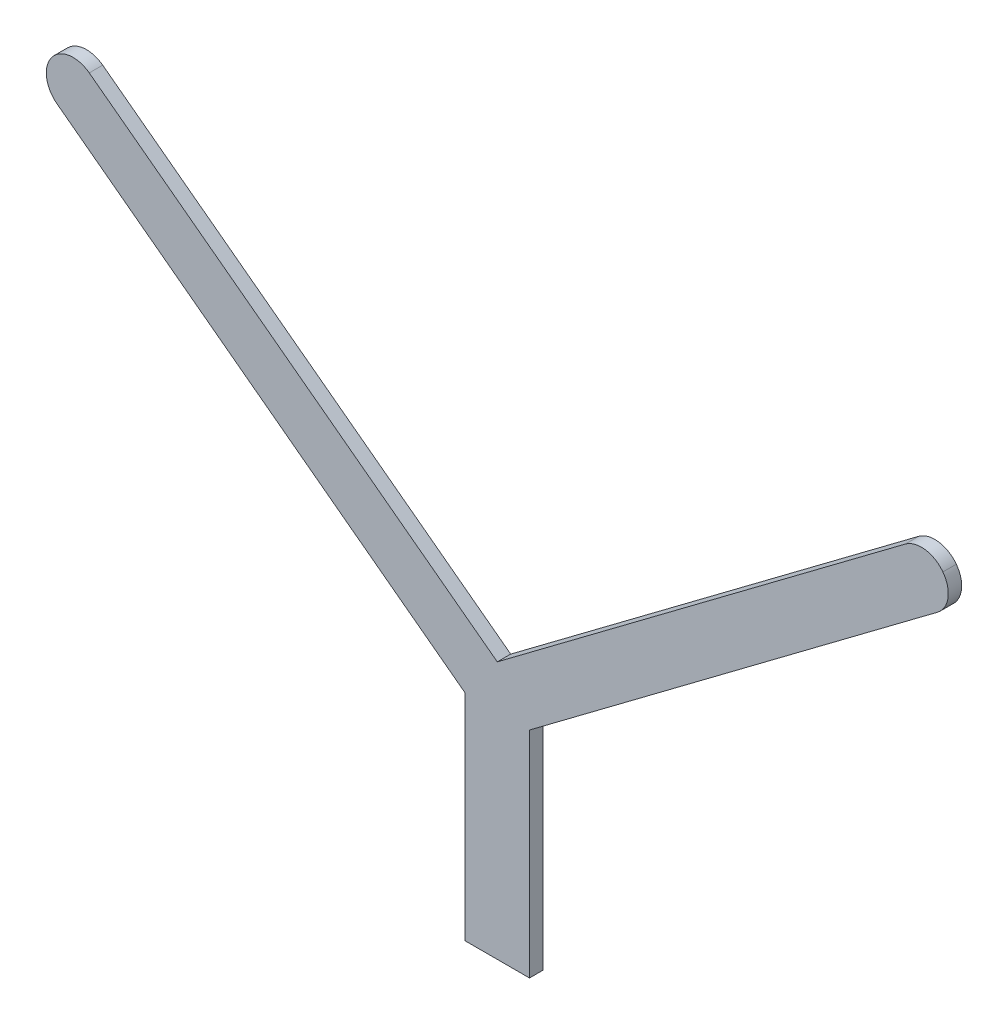
ISO-10303-21;
HEADER;
FILE_DESCRIPTION(('STEP AP214'),'2;1');
FILE_NAME('part.step','',(''),(''),'','','');
FILE_SCHEMA(('AUTOMOTIVE_DESIGN { 1 0 10303 214 1 1 1 1 }'));
ENDSEC;
DATA;
#1=APPLICATION_CONTEXT('core data for automotive mechanical design processes');
#2=APPLICATION_PROTOCOL_DEFINITION('international standard','automotive_design',2000,#1);
#3=PRODUCT_CONTEXT('',#1,'mechanical');
#4=PRODUCT('Part','Part','',(#3));
#5=PRODUCT_RELATED_PRODUCT_CATEGORY('part','',(#4));
#6=PRODUCT_DEFINITION_FORMATION('','',#4);
#7=PRODUCT_DEFINITION_CONTEXT('part definition',#1,'design');
#8=PRODUCT_DEFINITION('design','',#6,#7);
#9=PRODUCT_DEFINITION_SHAPE('','',#8);
#10=(LENGTH_UNIT() NAMED_UNIT(*) SI_UNIT(.MILLI.,.METRE.));
#11=(NAMED_UNIT(*) PLANE_ANGLE_UNIT() SI_UNIT($,.RADIAN.));
#12=(NAMED_UNIT(*) SI_UNIT($,.STERADIAN.) SOLID_ANGLE_UNIT());
#13=UNCERTAINTY_MEASURE_WITH_UNIT(LENGTH_MEASURE(1.E-05),#10,'distance_accuracy_value','');
#14=(GEOMETRIC_REPRESENTATION_CONTEXT(3) GLOBAL_UNCERTAINTY_ASSIGNED_CONTEXT((#13)) GLOBAL_UNIT_ASSIGNED_CONTEXT((#10,
#11,#12)) REPRESENTATION_CONTEXT('',''));
#15=CARTESIAN_POINT('',(0.,0.,0.));
#16=DIRECTION('',(0.,0.,1.));
#17=DIRECTION('',(1.,0.,0.));
#18=AXIS2_PLACEMENT_3D('',#15,#16,#17);
#19=CARTESIAN_POINT('',(0.,-507.797500764235,6.35));
#20=DIRECTION('',(-0.600003418919726,0.79999743579879,0.));
#21=DIRECTION('',(-0.79999743579879,-0.600003418919726,0.));
#22=AXIS2_PLACEMENT_3D('',#19,#20,#21);
#23=PLANE('',#22);
#24=DIRECTION('',(0.79999743579879,0.600003418919726,0.));
#25=VECTOR('',#24,1.);
#26=CARTESIAN_POINT('',(0.,-507.797500764235,6.35));
#27=LINE('',#26,#25);
#28=CARTESIAN_POINT('',(0.,-507.797500764235,6.35));
#29=VERTEX_POINT('',#28);
#30=CARTESIAN_POINT('',(193.040032565359,-363.016187294223,6.35));
#31=VERTEX_POINT('',#30);
#32=EDGE_CURVE('E149',#29,#31,#27,.T.);
#33=ORIENTED_EDGE('',*,*,#32,.T.);
#34=DIRECTION('',(0.,0.,-1.));
#35=VECTOR('',#34,1.);
#36=CARTESIAN_POINT('',(193.040032565359,-363.016187294223,6.35));
#37=LINE('',#36,#35);
#38=CARTESIAN_POINT('',(193.040032565359,-363.016187294223,0.));
#39=VERTEX_POINT('',#38);
#40=EDGE_CURVE('E160',#31,#39,#37,.T.);
#41=ORIENTED_EDGE('',*,*,#40,.T.);
#42=DIRECTION('',(0.79999743579879,0.600003418919726,0.));
#43=VECTOR('',#42,1.);
#44=CARTESIAN_POINT('',(0.,-507.797500764235,0.));
#45=LINE('',#44,#43);
#46=CARTESIAN_POINT('',(0.,-507.797500764235,0.));
#47=VERTEX_POINT('',#46);
#48=EDGE_CURVE('E133',#47,#39,#45,.T.);
#49=ORIENTED_EDGE('',*,*,#48,.F.);
#50=DIRECTION('',(0.,0.,-1.));
#51=VECTOR('',#50,1.);
#52=CARTESIAN_POINT('',(0.,-507.797500764235,6.35));
#53=LINE('',#52,#51);
#54=EDGE_CURVE('E165',#29,#47,#53,.T.);
#55=ORIENTED_EDGE('',*,*,#54,.F.);
#56=EDGE_LOOP('',(#33,#41,#49,#55));
#57=FACE_BOUND('',#56,.T.);
#58=ADVANCED_FACE('F39',(#57),#23,.T.);
#59=CARTESIAN_POINT('',(-203.199999999996,-355.396143873933,6.35));
#60=DIRECTION('',(0.600003418919763,0.799997435798762,0.));
#61=DIRECTION('',(-0.799997435798762,0.600003418919763,0.));
#62=AXIS2_PLACEMENT_3D('',#59,#60,#61);
#63=PLANE('',#62);
#64=DIRECTION('',(0.799997435798762,-0.600003418919763,0.));
#65=VECTOR('',#64,1.);
#66=CARTESIAN_POINT('',(-203.199999999996,-355.396143873933,0.));
#67=LINE('',#66,#65);
#68=CARTESIAN_POINT('',(-193.040032565352,-363.016187294214,0.));
#69=VERTEX_POINT('',#68);
#70=EDGE_CURVE('E240',#69,#47,#67,.T.);
#71=ORIENTED_EDGE('',*,*,#70,.F.);
#72=DIRECTION('',(0.,0.,-1.));
#73=VECTOR('',#72,1.);
#74=CARTESIAN_POINT('',(-193.040032565352,-363.016187294214,6.35));
#75=LINE('',#74,#73);
#76=CARTESIAN_POINT('',(-193.040032565352,-363.016187294214,6.35));
#77=VERTEX_POINT('',#76);
#78=EDGE_CURVE('E190',#69,#77,#75,.F.);
#79=ORIENTED_EDGE('',*,*,#78,.T.);
#80=DIRECTION('',(0.799997435798762,-0.600003418919763,0.));
#81=VECTOR('',#80,1.);
#82=CARTESIAN_POINT('',(-203.199999999996,-355.396143873933,6.35));
#83=LINE('',#82,#81);
#84=EDGE_CURVE('E156',#77,#29,#83,.T.);
#85=ORIENTED_EDGE('',*,*,#84,.T.);
#86=ORIENTED_EDGE('',*,*,#54,.T.);
#87=EDGE_LOOP('',(#71,#79,#85,#86));
#88=FACE_BOUND('',#87,.T.);
#89=ADVANCED_FACE('F269',(#88),#63,.T.);
#90=CARTESIAN_POINT('',(-218.440086840558,-375.716078743222,6.35));
#91=DIRECTION('',(0.600003418919763,0.799997435798762,0.));
#92=DIRECTION('',(-0.799997435798762,0.600003418919763,0.));
#93=AXIS2_PLACEMENT_3D('',#90,#91,#92);
#94=PLANE('',#93);
#95=DIRECTION('',(0.799997435798763,-0.600003418919763,0.));
#96=VECTOR('',#95,1.);
#97=CARTESIAN_POINT('',(-218.440086840558,-375.716078743222,6.35));
#98=LINE('',#97,#96);
#99=CARTESIAN_POINT('',(-208.280119405914,-383.336122163503,6.35));
#100=VERTEX_POINT('',#99);
#101=CARTESIAN_POINT('',(-15.2400868405617,-528.117435633524,6.35));
#102=VERTEX_POINT('',#101);
#103=EDGE_CURVE('E215',#100,#102,#98,.T.);
#104=ORIENTED_EDGE('',*,*,#103,.F.);
#105=DIRECTION('',(0.,0.,-1.));
#106=VECTOR('',#105,1.);
#107=CARTESIAN_POINT('',(-208.280119405914,-383.336122163503,6.35));
#108=LINE('',#107,#106);
#109=CARTESIAN_POINT('',(-208.280119405914,-383.336122163503,0.));
#110=VERTEX_POINT('',#109);
#111=EDGE_CURVE('E196',#100,#110,#108,.T.);
#112=ORIENTED_EDGE('',*,*,#111,.T.);
#113=DIRECTION('',(0.799997435798763,-0.600003418919763,0.));
#114=VECTOR('',#113,1.);
#115=CARTESIAN_POINT('',(-218.440086840558,-375.716078743222,0.));
#116=LINE('',#115,#114);
#117=CARTESIAN_POINT('',(-15.2400868405617,-528.117435633524,0.));
#118=VERTEX_POINT('',#117);
#119=EDGE_CURVE('E205',#110,#118,#116,.T.);
#120=ORIENTED_EDGE('',*,*,#119,.T.);
#121=DIRECTION('',(0.,0.,-1.));
#122=VECTOR('',#121,1.);
#123=CARTESIAN_POINT('',(-15.2400868405617,-528.117435633524,6.35));
#124=LINE('',#123,#122);
#125=EDGE_CURVE('E216',#102,#118,#124,.T.);
#126=ORIENTED_EDGE('',*,*,#125,.F.);
#127=EDGE_LOOP('',(#104,#112,#120,#126));
#128=FACE_BOUND('',#127,.T.);
#129=ADVANCED_FACE('F212',(#128),#94,.F.);
#130=CARTESIAN_POINT('',(-15.2400868405617,-528.117435633524,6.35));
#131=DIRECTION('',(1.,0.,0.));
#132=DIRECTION('',(0.,1.,0.));
#133=AXIS2_PLACEMENT_3D('',#130,#131,#132);
#134=PLANE('',#133);
#135=DIRECTION('',(0.,-1.,0.));
#136=VECTOR('',#135,1.);
#137=CARTESIAN_POINT('',(-15.2400868405617,-528.117435633524,0.));
#138=LINE('',#137,#136);
#139=CARTESIAN_POINT('',(-15.2400868405617,-629.717435633524,0.));
#140=VERTEX_POINT('',#139);
#141=EDGE_CURVE('E235',#118,#140,#138,.T.);
#142=ORIENTED_EDGE('',*,*,#141,.T.);
#143=DIRECTION('',(0.,0.,-1.));
#144=VECTOR('',#143,1.);
#145=CARTESIAN_POINT('',(-15.2400868405617,-629.717435633524,6.35));
#146=LINE('',#145,#144);
#147=CARTESIAN_POINT('',(-15.2400868405617,-629.717435633524,6.35));
#148=VERTEX_POINT('',#147);
#149=EDGE_CURVE('E153',#148,#140,#146,.T.);
#150=ORIENTED_EDGE('',*,*,#149,.F.);
#151=DIRECTION('',(0.,-1.,0.));
#152=VECTOR('',#151,1.);
#153=CARTESIAN_POINT('',(-15.2400868405617,-528.117435633524,6.35));
#154=LINE('',#153,#152);
#155=EDGE_CURVE('E219',#102,#148,#154,.T.);
#156=ORIENTED_EDGE('',*,*,#155,.F.);
#157=ORIENTED_EDGE('',*,*,#125,.T.);
#158=EDGE_LOOP('',(#142,#150,#156,#157));
#159=FACE_BOUND('',#158,.T.);
#160=ADVANCED_FACE('F277',(#159),#134,.F.);
#161=CARTESIAN_POINT('',(-15.2400868405617,-629.717435633524,6.35));
#162=DIRECTION('',(0.,1.,0.));
#163=DIRECTION('',(0.,0.,1.));
#164=AXIS2_PLACEMENT_3D('',#161,#162,#163);
#165=PLANE('',#164);
#166=DIRECTION('',(1.,0.,0.));
#167=VECTOR('',#166,1.);
#168=CARTESIAN_POINT('',(-15.2400868405617,-629.717435633524,0.));
#169=LINE('',#168,#167);
#170=CARTESIAN_POINT('',(15.2400868405614,-629.717435633524,0.));
#171=VERTEX_POINT('',#170);
#172=EDGE_CURVE('E232',#140,#171,#169,.T.);
#173=ORIENTED_EDGE('',*,*,#172,.T.);
#174=DIRECTION('',(0.,0.,-1.));
#175=VECTOR('',#174,1.);
#176=CARTESIAN_POINT('',(15.2400868405614,-629.717435633524,6.35));
#177=LINE('',#176,#175);
#178=CARTESIAN_POINT('',(15.2400868405614,-629.717435633524,6.35));
#179=VERTEX_POINT('',#178);
#180=EDGE_CURVE('E148',#179,#171,#177,.T.);
#181=ORIENTED_EDGE('',*,*,#180,.F.);
#182=DIRECTION('',(1.,0.,0.));
#183=VECTOR('',#182,1.);
#184=CARTESIAN_POINT('',(-15.2400868405617,-629.717435633524,6.35));
#185=LINE('',#184,#183);
#186=EDGE_CURVE('E138',#148,#179,#185,.T.);
#187=ORIENTED_EDGE('',*,*,#186,.F.);
#188=ORIENTED_EDGE('',*,*,#149,.T.);
#189=EDGE_LOOP('',(#173,#181,#187,#188));
#190=FACE_BOUND('',#189,.T.);
#191=ADVANCED_FACE('F255',(#190),#165,.F.);
#192=CARTESIAN_POINT('',(15.2400868405614,-629.717435633524,6.35));
#193=DIRECTION('',(-1.,0.,0.));
#194=DIRECTION('',(0.,-1.,0.));
#195=AXIS2_PLACEMENT_3D('',#192,#193,#194);
#196=PLANE('',#195);
#197=DIRECTION('',(0.,1.,0.));
#198=VECTOR('',#197,1.);
#199=CARTESIAN_POINT('',(15.2400868405614,-629.717435633524,0.));
#200=LINE('',#199,#198);
#201=CARTESIAN_POINT('',(15.2400868405617,-528.117435633524,0.));
#202=VERTEX_POINT('',#201);
#203=EDGE_CURVE('E146',#171,#202,#200,.T.);
#204=ORIENTED_EDGE('',*,*,#203,.T.);
#205=DIRECTION('',(0.,0.,-1.));
#206=VECTOR('',#205,1.);
#207=CARTESIAN_POINT('',(15.2400868405617,-528.117435633524,6.35));
#208=LINE('',#207,#206);
#209=CARTESIAN_POINT('',(15.2400868405617,-528.117435633524,6.35));
#210=VERTEX_POINT('',#209);
#211=EDGE_CURVE('E126',#210,#202,#208,.T.);
#212=ORIENTED_EDGE('',*,*,#211,.F.);
#213=DIRECTION('',(0.,1.,0.));
#214=VECTOR('',#213,1.);
#215=CARTESIAN_POINT('',(15.2400868405614,-629.717435633524,6.35));
#216=LINE('',#215,#214);
#217=EDGE_CURVE('E132',#179,#210,#216,.T.);
#218=ORIENTED_EDGE('',*,*,#217,.F.);
#219=ORIENTED_EDGE('',*,*,#180,.T.);
#220=EDGE_LOOP('',(#204,#212,#218,#219));
#221=FACE_BOUND('',#220,.T.);
#222=ADVANCED_FACE('F144',(#221),#196,.F.);
#223=CARTESIAN_POINT('',(218.440086840564,-375.716078743232,6.35));
#224=DIRECTION('',(0.600003418919727,-0.79999743579879,0.));
#225=DIRECTION('',(0.79999743579879,0.600003418919727,0.));
#226=AXIS2_PLACEMENT_3D('',#223,#224,#225);
#227=PLANE('',#226);
#228=DIRECTION('',(-0.79999743579879,-0.600003418919727,0.));
#229=VECTOR('',#228,1.);
#230=CARTESIAN_POINT('',(218.440086840564,-375.716078743232,0.));
#231=LINE('',#230,#229);
#232=CARTESIAN_POINT('',(208.28011940592,-383.336122163512,0.));
#233=VERTEX_POINT('',#232);
#234=EDGE_CURVE('E227',#233,#202,#231,.T.);
#235=ORIENTED_EDGE('',*,*,#234,.F.);
#236=DIRECTION('',(0.,0.,-1.));
#237=VECTOR('',#236,1.);
#238=CARTESIAN_POINT('',(208.28011940592,-383.336122163512,6.35));
#239=LINE('',#238,#237);
#240=CARTESIAN_POINT('',(208.28011940592,-383.336122163512,6.35));
#241=VERTEX_POINT('',#240);
#242=EDGE_CURVE('E129',#233,#241,#239,.F.);
#243=ORIENTED_EDGE('',*,*,#242,.T.);
#244=DIRECTION('',(-0.79999743579879,-0.600003418919727,0.));
#245=VECTOR('',#244,1.);
#246=CARTESIAN_POINT('',(218.440086840564,-375.716078743232,6.35));
#247=LINE('',#246,#245);
#248=EDGE_CURVE('E121',#241,#210,#247,.T.);
#249=ORIENTED_EDGE('',*,*,#248,.T.);
#250=ORIENTED_EDGE('',*,*,#211,.T.);
#251=EDGE_LOOP('',(#235,#243,#249,#250));
#252=FACE_BOUND('',#251,.T.);
#253=ADVANCED_FACE('F124',(#252),#227,.T.);
#254=CARTESIAN_POINT('',(0.,0.,6.35));
#255=DIRECTION('',(0.,0.,-1.));
#256=DIRECTION('',(-1.,0.,0.));
#257=AXIS2_PLACEMENT_3D('',#254,#255,#256);
#258=PLANE('',#257);
#259=CARTESIAN_POINT('',(-200.660075985633,-373.176154728859,6.35));
#260=DIRECTION('',(0.,0.,-1.));
#261=DIRECTION('',(-1.,0.,0.));
#262=AXIS2_PLACEMENT_3D('',#259,#260,#261);
#263=CIRCLE('',#262,12.7);
#264=CARTESIAN_POINT('',(-210.820043420277,-365.556111308578,6.35));
#265=VERTEX_POINT('',#264);
#266=EDGE_CURVE('E193',#77,#265,#263,.F.);
#267=ORIENTED_EDGE('',*,*,#266,.T.);
#268=CARTESIAN_POINT('',(-200.660075985633,-373.176154728859,6.35));
#269=DIRECTION('',(0.,0.,-1.));
#270=DIRECTION('',(-1.,0.,0.));
#271=AXIS2_PLACEMENT_3D('',#268,#269,#270);
#272=CIRCLE('',#271,12.7);
#273=EDGE_CURVE('E11',#265,#100,#272,.F.);
#274=ORIENTED_EDGE('',*,*,#273,.T.);
#275=ORIENTED_EDGE('',*,*,#103,.T.);
#276=ORIENTED_EDGE('',*,*,#155,.T.);
#277=ORIENTED_EDGE('',*,*,#186,.T.);
#278=ORIENTED_EDGE('',*,*,#217,.T.);
#279=ORIENTED_EDGE('',*,*,#248,.F.);
#280=CARTESIAN_POINT('',(200.660075985639,-373.176154728868,6.35));
#281=DIRECTION('',(0.,0.,-1.));
#282=DIRECTION('',(-1.,0.,0.));
#283=AXIS2_PLACEMENT_3D('',#280,#281,#282);
#284=CIRCLE('',#283,12.7);
#285=CARTESIAN_POINT('',(210.820043420284,-365.556111308587,6.35));
#286=VERTEX_POINT('',#285);
#287=EDGE_CURVE('E181',#241,#286,#284,.F.);
#288=ORIENTED_EDGE('',*,*,#287,.T.);
#289=CARTESIAN_POINT('',(200.660075985639,-373.176154728868,6.35));
#290=DIRECTION('',(0.,0.,-1.));
#291=DIRECTION('',(-1.,0.,0.));
#292=AXIS2_PLACEMENT_3D('',#289,#290,#291);
#293=CIRCLE('',#292,12.7);
#294=EDGE_CURVE('E173',#286,#31,#293,.F.);
#295=ORIENTED_EDGE('',*,*,#294,.T.);
#296=ORIENTED_EDGE('',*,*,#32,.F.);
#297=ORIENTED_EDGE('',*,*,#84,.F.);
#298=EDGE_LOOP('',(#267,#274,#275,#276,#277,#278,#279,#288,#295,#296,#297));
#299=FACE_BOUND('',#298,.T.);
#300=ADVANCED_FACE('F136',(#299),#258,.F.);
#301=CARTESIAN_POINT('',(0.,0.,0.));
#302=DIRECTION('',(0.,0.,-1.));
#303=DIRECTION('',(-1.,0.,0.));
#304=AXIS2_PLACEMENT_3D('',#301,#302,#303);
#305=PLANE('',#304);
#306=ORIENTED_EDGE('',*,*,#119,.F.);
#307=CARTESIAN_POINT('',(-200.660075985633,-373.176154728859,0.));
#308=DIRECTION('',(0.,0.,-1.));
#309=DIRECTION('',(-1.,0.,0.));
#310=AXIS2_PLACEMENT_3D('',#307,#308,#309);
#311=CIRCLE('',#310,12.7);
#312=CARTESIAN_POINT('',(-210.820043420277,-365.556111308578,0.));
#313=VERTEX_POINT('',#312);
#314=EDGE_CURVE('E48',#110,#313,#311,.T.);
#315=ORIENTED_EDGE('',*,*,#314,.T.);
#316=CARTESIAN_POINT('',(-200.660075985633,-373.176154728859,0.));
#317=DIRECTION('',(0.,0.,-1.));
#318=DIRECTION('',(-1.,0.,0.));
#319=AXIS2_PLACEMENT_3D('',#316,#317,#318);
#320=CIRCLE('',#319,12.7);
#321=EDGE_CURVE('E187',#313,#69,#320,.T.);
#322=ORIENTED_EDGE('',*,*,#321,.T.);
#323=ORIENTED_EDGE('',*,*,#70,.T.);
#324=ORIENTED_EDGE('',*,*,#48,.T.);
#325=CARTESIAN_POINT('',(200.660075985639,-373.176154728868,0.));
#326=DIRECTION('',(0.,0.,-1.));
#327=DIRECTION('',(-1.,0.,0.));
#328=AXIS2_PLACEMENT_3D('',#325,#326,#327);
#329=CIRCLE('',#328,12.7);
#330=CARTESIAN_POINT('',(210.820043420284,-365.556111308587,0.));
#331=VERTEX_POINT('',#330);
#332=EDGE_CURVE('E164',#39,#331,#329,.T.);
#333=ORIENTED_EDGE('',*,*,#332,.T.);
#334=CARTESIAN_POINT('',(200.660075985639,-373.176154728868,0.));
#335=DIRECTION('',(0.,0.,-1.));
#336=DIRECTION('',(-1.,0.,0.));
#337=AXIS2_PLACEMENT_3D('',#334,#335,#336);
#338=CIRCLE('',#337,12.7);
#339=EDGE_CURVE('E176',#331,#233,#338,.T.);
#340=ORIENTED_EDGE('',*,*,#339,.T.);
#341=ORIENTED_EDGE('',*,*,#234,.T.);
#342=ORIENTED_EDGE('',*,*,#203,.F.);
#343=ORIENTED_EDGE('',*,*,#172,.F.);
#344=ORIENTED_EDGE('',*,*,#141,.F.);
#345=EDGE_LOOP('',(#306,#315,#322,#323,#324,#333,#340,#341,#342,#343,#344));
#346=FACE_BOUND('',#345,.T.);
#347=ADVANCED_FACE('F202',(#346),#305,.T.);
#348=CARTESIAN_POINT('',(200.660075985639,-373.176154728868,6.35));
#349=DIRECTION('',(0.,0.,-1.));
#350=DIRECTION('',(-1.,0.,0.));
#351=AXIS2_PLACEMENT_3D('',#348,#349,#350);
#352=CYLINDRICAL_SURFACE('',#351,12.7);
#353=ORIENTED_EDGE('',*,*,#294,.F.);
#354=DIRECTION('',(0.,0.,-1.));
#355=VECTOR('',#354,1.);
#356=CARTESIAN_POINT('',(210.820043420284,-365.556111308587,6.35));
#357=LINE('',#356,#355);
#358=EDGE_CURVE('E169',#331,#286,#357,.F.);
#359=ORIENTED_EDGE('',*,*,#358,.F.);
#360=ORIENTED_EDGE('',*,*,#332,.F.);
#361=ORIENTED_EDGE('',*,*,#40,.F.);
#362=EDGE_LOOP('',(#353,#359,#360,#361));
#363=FACE_BOUND('',#362,.T.);
#364=ADVANCED_FACE('F264',(#363),#352,.T.);
#365=CARTESIAN_POINT('',(200.660075985639,-373.176154728868,6.35));
#366=DIRECTION('',(0.,0.,-1.));
#367=DIRECTION('',(-1.,0.,0.));
#368=AXIS2_PLACEMENT_3D('',#365,#366,#367);
#369=CYLINDRICAL_SURFACE('',#368,12.7);
#370=ORIENTED_EDGE('',*,*,#287,.F.);
#371=ORIENTED_EDGE('',*,*,#242,.F.);
#372=ORIENTED_EDGE('',*,*,#339,.F.);
#373=ORIENTED_EDGE('',*,*,#358,.T.);
#374=EDGE_LOOP('',(#370,#371,#372,#373));
#375=FACE_BOUND('',#374,.T.);
#376=ADVANCED_FACE('F258',(#375),#369,.T.);
#377=CARTESIAN_POINT('',(-200.660075985633,-373.176154728859,6.35));
#378=DIRECTION('',(0.,0.,1.));
#379=DIRECTION('',(1.,0.,0.));
#380=AXIS2_PLACEMENT_3D('',#377,#378,#379);
#381=CYLINDRICAL_SURFACE('',#380,12.7);
#382=ORIENTED_EDGE('',*,*,#266,.F.);
#383=ORIENTED_EDGE('',*,*,#78,.F.);
#384=ORIENTED_EDGE('',*,*,#321,.F.);
#385=DIRECTION('',(0.,0.,-1.));
#386=VECTOR('',#385,1.);
#387=CARTESIAN_POINT('',(-210.820043420277,-365.556111308578,0.));
#388=LINE('',#387,#386);
#389=EDGE_CURVE('E184',#265,#313,#388,.T.);
#390=ORIENTED_EDGE('',*,*,#389,.F.);
#391=EDGE_LOOP('',(#382,#383,#384,#390));
#392=FACE_BOUND('',#391,.T.);
#393=ADVANCED_FACE('F210',(#392),#381,.T.);
#394=CARTESIAN_POINT('',(-200.660075985633,-373.176154728859,6.35));
#395=DIRECTION('',(0.,0.,-1.));
#396=DIRECTION('',(-1.,0.,0.));
#397=AXIS2_PLACEMENT_3D('',#394,#395,#396);
#398=CYLINDRICAL_SURFACE('',#397,12.7);
#399=ORIENTED_EDGE('',*,*,#273,.F.);
#400=ORIENTED_EDGE('',*,*,#389,.T.);
#401=ORIENTED_EDGE('',*,*,#314,.F.);
#402=ORIENTED_EDGE('',*,*,#111,.F.);
#403=EDGE_LOOP('',(#399,#400,#401,#402));
#404=FACE_BOUND('',#403,.T.);
#405=ADVANCED_FACE('F41',(#404),#398,.T.);
#406=CLOSED_SHELL('',(#58,#89,#129,#160,#191,#222,#253,#300,#347,#364,#376,#393,#405));
#407=MANIFOLD_SOLID_BREP('B2',#406);
#408=ADVANCED_BREP_SHAPE_REPRESENTATION('',(#18,#407),#14);
#409=SHAPE_DEFINITION_REPRESENTATION(#9,#408);
ENDSEC;
END-ISO-10303-21;
